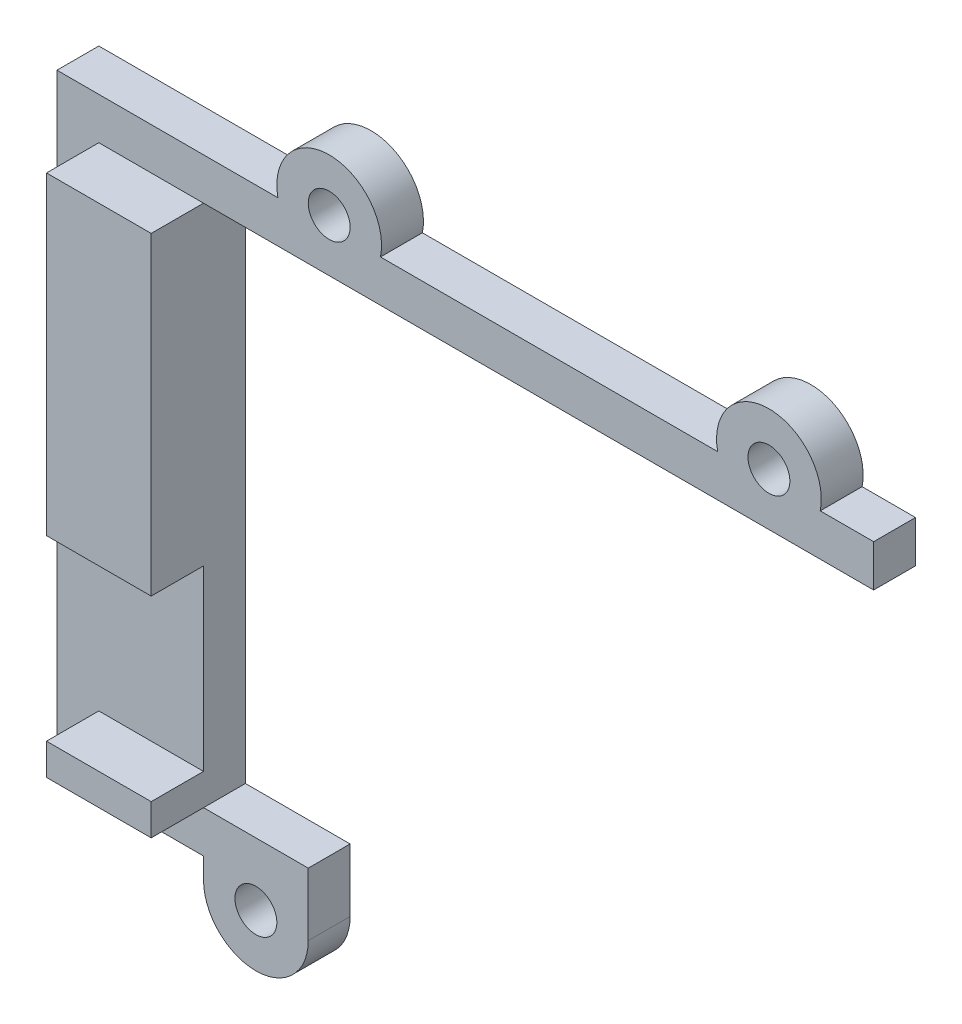
ISO-10303-21;
HEADER;
FILE_DESCRIPTION(('STEP AP214'),'2;1');
FILE_NAME('part.step','',(''),(''),'','','');
FILE_SCHEMA(('AUTOMOTIVE_DESIGN { 1 0 10303 214 1 1 1 1 }'));
ENDSEC;
DATA;
#1=APPLICATION_CONTEXT('core data for automotive mechanical design processes');
#2=APPLICATION_PROTOCOL_DEFINITION('international standard','automotive_design',2000,#1);
#3=PRODUCT_CONTEXT('',#1,'mechanical');
#4=PRODUCT('Part','Part','',(#3));
#5=PRODUCT_RELATED_PRODUCT_CATEGORY('part','',(#4));
#6=PRODUCT_DEFINITION_FORMATION('','',#4);
#7=PRODUCT_DEFINITION_CONTEXT('part definition',#1,'design');
#8=PRODUCT_DEFINITION('design','',#6,#7);
#9=PRODUCT_DEFINITION_SHAPE('','',#8);
#10=(LENGTH_UNIT() NAMED_UNIT(*) SI_UNIT(.MILLI.,.METRE.));
#11=(NAMED_UNIT(*) PLANE_ANGLE_UNIT() SI_UNIT($,.RADIAN.));
#12=(NAMED_UNIT(*) SI_UNIT($,.STERADIAN.) SOLID_ANGLE_UNIT());
#13=UNCERTAINTY_MEASURE_WITH_UNIT(LENGTH_MEASURE(1.E-05),#10,'distance_accuracy_value','');
#14=(GEOMETRIC_REPRESENTATION_CONTEXT(3) GLOBAL_UNCERTAINTY_ASSIGNED_CONTEXT((#13)) GLOBAL_UNIT_ASSIGNED_CONTEXT((#10,
#11,#12)) REPRESENTATION_CONTEXT('',''));
#15=CARTESIAN_POINT('',(0.,0.,0.));
#16=DIRECTION('',(0.,0.,1.));
#17=DIRECTION('',(1.,0.,0.));
#18=AXIS2_PLACEMENT_3D('',#15,#16,#17);
#19=CARTESIAN_POINT('',(-21.5,41.5,-4.5));
#20=DIRECTION('',(-1.,0.,0.));
#21=DIRECTION('',(0.,-1.,0.));
#22=AXIS2_PLACEMENT_3D('',#19,#20,#21);
#23=PLANE('',#22);
#24=DIRECTION('',(0.,1.,0.));
#25=VECTOR('',#24,1.);
#26=CARTESIAN_POINT('',(-21.5,41.5,-7.));
#27=LINE('',#26,#25);
#28=CARTESIAN_POINT('',(-21.5,26.5,-7.));
#29=VERTEX_POINT('',#28);
#30=CARTESIAN_POINT('',(-21.5,41.5,-7.));
#31=VERTEX_POINT('',#30);
#32=EDGE_CURVE('E338',#29,#31,#27,.T.);
#33=ORIENTED_EDGE('',*,*,#32,.F.);
#34=DIRECTION('',(0.,0.,-1.));
#35=VECTOR('',#34,1.);
#36=CARTESIAN_POINT('',(-21.5,26.5,-4.5));
#37=LINE('',#36,#35);
#38=CARTESIAN_POINT('',(-21.5,26.5,-4.5));
#39=VERTEX_POINT('',#38);
#40=EDGE_CURVE('E11',#39,#29,#37,.T.);
#41=ORIENTED_EDGE('',*,*,#40,.F.);
#42=DIRECTION('',(0.,1.,0.));
#43=VECTOR('',#42,1.);
#44=CARTESIAN_POINT('',(-21.5,41.5,-4.5));
#45=LINE('',#44,#43);
#46=CARTESIAN_POINT('',(-21.5,41.5,-4.5));
#47=VERTEX_POINT('',#46);
#48=EDGE_CURVE('E339',#39,#47,#45,.T.);
#49=ORIENTED_EDGE('',*,*,#48,.T.);
#50=DIRECTION('',(0.,0.,-1.));
#51=VECTOR('',#50,1.);
#52=CARTESIAN_POINT('',(-21.5,41.5,-4.5));
#53=LINE('',#52,#51);
#54=EDGE_CURVE('E36',#47,#31,#53,.T.);
#55=ORIENTED_EDGE('',*,*,#54,.T.);
#56=EDGE_LOOP('',(#33,#41,#49,#55));
#57=FACE_BOUND('',#56,.T.);
#58=ADVANCED_FACE('F33',(#57),#23,.T.);
#59=CARTESIAN_POINT('',(-21.5,26.5,-4.5));
#60=DIRECTION('',(0.,-1.,0.));
#61=DIRECTION('',(0.,0.,-1.));
#62=AXIS2_PLACEMENT_3D('',#59,#60,#61);
#63=PLANE('',#62);
#64=DIRECTION('',(-1.,0.,0.));
#65=VECTOR('',#64,1.);
#66=CARTESIAN_POINT('',(-21.5,26.5,-7.));
#67=LINE('',#66,#65);
#68=CARTESIAN_POINT('',(-16.5,26.5,-7.));
#69=VERTEX_POINT('',#68);
#70=EDGE_CURVE('E342',#69,#29,#67,.T.);
#71=ORIENTED_EDGE('',*,*,#70,.F.);
#72=DIRECTION('',(0.,0.,-1.));
#73=VECTOR('',#72,1.);
#74=CARTESIAN_POINT('',(-16.5,26.5,-4.5));
#75=LINE('',#74,#73);
#76=CARTESIAN_POINT('',(-16.5,26.5,-4.5));
#77=VERTEX_POINT('',#76);
#78=EDGE_CURVE('E41',#77,#69,#75,.T.);
#79=ORIENTED_EDGE('',*,*,#78,.F.);
#80=DIRECTION('',(-1.,0.,0.));
#81=VECTOR('',#80,1.);
#82=CARTESIAN_POINT('',(-21.5,26.5,-4.5));
#83=LINE('',#82,#81);
#84=EDGE_CURVE('E346',#77,#39,#83,.T.);
#85=ORIENTED_EDGE('',*,*,#84,.T.);
#86=ORIENTED_EDGE('',*,*,#40,.T.);
#87=EDGE_LOOP('',(#71,#79,#85,#86));
#88=FACE_BOUND('',#87,.T.);
#89=ADVANCED_FACE('F364',(#88),#63,.T.);
#90=CARTESIAN_POINT('',(-16.5,41.5,-4.5));
#91=DIRECTION('',(1.,0.,0.));
#92=DIRECTION('',(0.,1.,0.));
#93=AXIS2_PLACEMENT_3D('',#90,#91,#92);
#94=PLANE('',#93);
#95=ORIENTED_EDGE('',*,*,#78,.T.);
#96=DIRECTION('',(0.,-1.,0.));
#97=VECTOR('',#96,1.);
#98=CARTESIAN_POINT('',(-16.5,41.5,-7.));
#99=LINE('',#98,#97);
#100=CARTESIAN_POINT('',(-16.5,18.,-7.));
#101=VERTEX_POINT('',#100);
#102=EDGE_CURVE('E286',#69,#101,#99,.T.);
#103=ORIENTED_EDGE('',*,*,#102,.T.);
#104=DIRECTION('',(0.,0.,-1.));
#105=VECTOR('',#104,1.);
#106=CARTESIAN_POINT('',(-16.5,18.,-4.5));
#107=LINE('',#106,#105);
#108=CARTESIAN_POINT('',(-16.5,18.,-4.5));
#109=VERTEX_POINT('',#108);
#110=EDGE_CURVE('E49',#109,#101,#107,.T.);
#111=ORIENTED_EDGE('',*,*,#110,.F.);
#112=DIRECTION('',(0.,-1.,0.));
#113=VECTOR('',#112,1.);
#114=CARTESIAN_POINT('',(-16.5,16.5,-4.5));
#115=LINE('',#114,#113);
#116=CARTESIAN_POINT('',(-16.5,16.5,-4.5));
#117=VERTEX_POINT('',#116);
#118=EDGE_CURVE('E201',#109,#117,#115,.T.);
#119=ORIENTED_EDGE('',*,*,#118,.T.);
#120=DIRECTION('',(0.,0.,-1.));
#121=VECTOR('',#120,1.);
#122=CARTESIAN_POINT('',(-16.5,16.5,-4.5));
#123=LINE('',#122,#121);
#124=CARTESIAN_POINT('',(-16.5,16.5,-7.));
#125=VERTEX_POINT('',#124);
#126=EDGE_CURVE('E217',#117,#125,#123,.T.);
#127=ORIENTED_EDGE('',*,*,#126,.T.);
#128=DIRECTION('',(0.,0.,1.));
#129=VECTOR('',#128,1.);
#130=CARTESIAN_POINT('',(-16.5,16.5,-9.));
#131=LINE('',#130,#129);
#132=CARTESIAN_POINT('',(-16.5,16.5,-9.));
#133=VERTEX_POINT('',#132);
#134=EDGE_CURVE('E311',#133,#125,#131,.T.);
#135=ORIENTED_EDGE('',*,*,#134,.F.);
#136=DIRECTION('',(0.,-1.,0.));
#137=VECTOR('',#136,1.);
#138=CARTESIAN_POINT('',(-16.5,41.5,-9.));
#139=LINE('',#138,#137);
#140=CARTESIAN_POINT('',(-16.5,41.5,-9.));
#141=VERTEX_POINT('',#140);
#142=EDGE_CURVE('E256',#141,#133,#139,.T.);
#143=ORIENTED_EDGE('',*,*,#142,.F.);
#144=DIRECTION('',(0.,0.,1.));
#145=VECTOR('',#144,1.);
#146=CARTESIAN_POINT('',(-16.5,41.5,-9.));
#147=LINE('',#146,#145);
#148=CARTESIAN_POINT('',(-16.5,41.5,-7.));
#149=VERTEX_POINT('',#148);
#150=EDGE_CURVE('E314',#141,#149,#147,.T.);
#151=ORIENTED_EDGE('',*,*,#150,.T.);
#152=DIRECTION('',(0.,0.,-1.));
#153=VECTOR('',#152,1.);
#154=CARTESIAN_POINT('',(-16.5,41.5,-4.5));
#155=LINE('',#154,#153);
#156=CARTESIAN_POINT('',(-16.5,41.5,-4.5));
#157=VERTEX_POINT('',#156);
#158=EDGE_CURVE('E356',#157,#149,#155,.T.);
#159=ORIENTED_EDGE('',*,*,#158,.F.);
#160=DIRECTION('',(0.,-1.,0.));
#161=VECTOR('',#160,1.);
#162=CARTESIAN_POINT('',(-16.5,41.5,-4.5));
#163=LINE('',#162,#161);
#164=EDGE_CURVE('E344',#157,#77,#163,.T.);
#165=ORIENTED_EDGE('',*,*,#164,.T.);
#166=EDGE_LOOP('',(#95,#103,#111,#119,#127,#135,#143,#151,#159,#165));
#167=FACE_BOUND('',#166,.T.);
#168=ADVANCED_FACE('F369',(#167),#94,.T.);
#169=CARTESIAN_POINT('',(-21.5,41.5,-4.5));
#170=DIRECTION('',(0.,1.,0.));
#171=DIRECTION('',(0.,0.,1.));
#172=AXIS2_PLACEMENT_3D('',#169,#170,#171);
#173=PLANE('',#172);
#174=DIRECTION('',(1.,0.,0.));
#175=VECTOR('',#174,1.);
#176=CARTESIAN_POINT('',(-21.5,41.5,-7.));
#177=LINE('',#176,#175);
#178=EDGE_CURVE('E351',#31,#149,#177,.T.);
#179=ORIENTED_EDGE('',*,*,#178,.F.);
#180=ORIENTED_EDGE('',*,*,#54,.F.);
#181=DIRECTION('',(1.,0.,0.));
#182=VECTOR('',#181,1.);
#183=CARTESIAN_POINT('',(-21.5,41.5,-4.5));
#184=LINE('',#183,#182);
#185=EDGE_CURVE('E341',#47,#157,#184,.T.);
#186=ORIENTED_EDGE('',*,*,#185,.T.);
#187=ORIENTED_EDGE('',*,*,#158,.T.);
#188=EDGE_LOOP('',(#179,#180,#186,#187));
#189=FACE_BOUND('',#188,.T.);
#190=ADVANCED_FACE('F357',(#189),#173,.T.);
#191=CARTESIAN_POINT('',(0.,0.,-4.5));
#192=DIRECTION('',(0.,0.,1.));
#193=DIRECTION('',(1.,0.,0.));
#194=AXIS2_PLACEMENT_3D('',#191,#192,#193);
#195=PLANE('',#194);
#196=ORIENTED_EDGE('',*,*,#48,.F.);
#197=ORIENTED_EDGE('',*,*,#84,.F.);
#198=ORIENTED_EDGE('',*,*,#164,.F.);
#199=ORIENTED_EDGE('',*,*,#185,.F.);
#200=EDGE_LOOP('',(#196,#197,#198,#199));
#201=FACE_BOUND('',#200,.T.);
#202=ADVANCED_FACE('F368',(#201),#195,.T.);
#203=CARTESIAN_POINT('',(-14.,13.5,-7.));
#204=DIRECTION('',(0.,0.,-1.));
#205=DIRECTION('',(-1.,0.,0.));
#206=AXIS2_PLACEMENT_3D('',#203,#204,#205);
#207=PLANE('',#206);
#208=CARTESIAN_POINT('',(10.5,44.,-7.));
#209=DIRECTION('',(0.,0.,-1.));
#210=DIRECTION('',(-1.,0.,0.));
#211=AXIS2_PLACEMENT_3D('',#208,#209,#210);
#212=CIRCLE('',#211,1.);
#213=CARTESIAN_POINT('',(9.49999999999999,44.,-7.));
#214=VERTEX_POINT('',#213);
#215=EDGE_CURVE('E229',#214,#214,#212,.T.);
#216=ORIENTED_EDGE('',*,*,#215,.T.);
#217=EDGE_LOOP('',(#216));
#218=FACE_BOUND('',#217,.T.);
#219=CARTESIAN_POINT('',(-10.5,44.,-7.));
#220=DIRECTION('',(0.,0.,-1.));
#221=DIRECTION('',(-1.,0.,0.));
#222=AXIS2_PLACEMENT_3D('',#219,#220,#221);
#223=CIRCLE('',#222,1.);
#224=CARTESIAN_POINT('',(-11.5,44.,-7.));
#225=VERTEX_POINT('',#224);
#226=EDGE_CURVE('E223',#225,#225,#223,.T.);
#227=ORIENTED_EDGE('',*,*,#226,.T.);
#228=EDGE_LOOP('',(#227));
#229=FACE_BOUND('',#228,.T.);
#230=CARTESIAN_POINT('',(-14.,13.5,-7.));
#231=DIRECTION('',(0.,0.,-1.));
#232=DIRECTION('',(-1.,0.,0.));
#233=AXIS2_PLACEMENT_3D('',#230,#231,#232);
#234=CIRCLE('',#233,1.);
#235=CARTESIAN_POINT('',(-15.,13.5,-7.));
#236=VERTEX_POINT('',#235);
#237=EDGE_CURVE('E216',#236,#236,#234,.T.);
#238=ORIENTED_EDGE('',*,*,#237,.T.);
#239=EDGE_LOOP('',(#238));
#240=FACE_BOUND('',#239,.T.);
#241=DIRECTION('',(1.,0.,0.));
#242=VECTOR('',#241,1.);
#243=CARTESIAN_POINT('',(-11.5,16.5,-7.));
#244=LINE('',#243,#242);
#245=CARTESIAN_POINT('',(-11.5,16.5,-7.));
#246=VERTEX_POINT('',#245);
#247=EDGE_CURVE('E288',#125,#246,#244,.T.);
#248=ORIENTED_EDGE('',*,*,#247,.F.);
#249=DIRECTION('',(-1.,0.,0.));
#250=VECTOR('',#249,1.);
#251=CARTESIAN_POINT('',(-21.5,16.5,-7.));
#252=LINE('',#251,#250);
#253=CARTESIAN_POINT('',(-21.5,16.5,-7.));
#254=VERTEX_POINT('',#253);
#255=EDGE_CURVE('E205',#125,#254,#252,.T.);
#256=ORIENTED_EDGE('',*,*,#255,.T.);
#257=DIRECTION('',(0.,1.,0.));
#258=VECTOR('',#257,1.);
#259=CARTESIAN_POINT('',(-21.5,16.5,-7.));
#260=LINE('',#259,#258);
#261=CARTESIAN_POINT('',(-21.5,18.,-7.));
#262=VERTEX_POINT('',#261);
#263=EDGE_CURVE('E212',#254,#262,#260,.T.);
#264=ORIENTED_EDGE('',*,*,#263,.T.);
#265=DIRECTION('',(1.,0.,0.));
#266=VECTOR('',#265,1.);
#267=CARTESIAN_POINT('',(-21.5,18.,-7.));
#268=LINE('',#267,#266);
#269=EDGE_CURVE('E186',#262,#101,#268,.T.);
#270=ORIENTED_EDGE('',*,*,#269,.T.);
#271=ORIENTED_EDGE('',*,*,#102,.F.);
#272=ORIENTED_EDGE('',*,*,#70,.T.);
#273=ORIENTED_EDGE('',*,*,#32,.T.);
#274=ORIENTED_EDGE('',*,*,#178,.T.);
#275=DIRECTION('',(-1.,0.,0.));
#276=VECTOR('',#275,1.);
#277=CARTESIAN_POINT('',(15.5,41.5,-7.));
#278=LINE('',#277,#276);
#279=CARTESIAN_POINT('',(15.5,41.5,-7.));
#280=VERTEX_POINT('',#279);
#281=EDGE_CURVE('E283',#280,#149,#278,.T.);
#282=ORIENTED_EDGE('',*,*,#281,.F.);
#283=DIRECTION('',(0.,-1.,0.));
#284=VECTOR('',#283,1.);
#285=CARTESIAN_POINT('',(15.5,43.5,-7.));
#286=LINE('',#285,#284);
#287=CARTESIAN_POINT('',(15.5,43.5,-7.));
#288=VERTEX_POINT('',#287);
#289=EDGE_CURVE('E281',#288,#280,#286,.T.);
#290=ORIENTED_EDGE('',*,*,#289,.F.);
#291=DIRECTION('',(1.,0.,0.));
#292=VECTOR('',#291,1.);
#293=CARTESIAN_POINT('',(12.9494897427832,43.5,-7.));
#294=LINE('',#293,#292);
#295=CARTESIAN_POINT('',(12.9494897427832,43.5,-7.));
#296=VERTEX_POINT('',#295);
#297=EDGE_CURVE('E279',#296,#288,#294,.T.);
#298=ORIENTED_EDGE('',*,*,#297,.F.);
#299=CARTESIAN_POINT('',(10.5,44.,-7.));
#300=DIRECTION('',(0.,0.,-1.));
#301=DIRECTION('',(-1.,0.,0.));
#302=AXIS2_PLACEMENT_3D('',#299,#300,#301);
#303=CIRCLE('',#302,2.5);
#304=CARTESIAN_POINT('',(8.05051025721681,43.5,-7.));
#305=VERTEX_POINT('',#304);
#306=EDGE_CURVE('E277',#305,#296,#303,.T.);
#307=ORIENTED_EDGE('',*,*,#306,.F.);
#308=DIRECTION('',(1.,0.,0.));
#309=VECTOR('',#308,1.);
#310=CARTESIAN_POINT('',(-8.05051025721683,43.5,-7.));
#311=LINE('',#310,#309);
#312=CARTESIAN_POINT('',(-8.05051025721683,43.5,-7.));
#313=VERTEX_POINT('',#312);
#314=EDGE_CURVE('E275',#313,#305,#311,.T.);
#315=ORIENTED_EDGE('',*,*,#314,.F.);
#316=CARTESIAN_POINT('',(-10.5,44.,-7.));
#317=DIRECTION('',(0.,0.,-1.));
#318=DIRECTION('',(-1.,0.,0.));
#319=AXIS2_PLACEMENT_3D('',#316,#317,#318);
#320=CIRCLE('',#319,2.5);
#321=CARTESIAN_POINT('',(-12.9494897427832,43.5,-7.));
#322=VERTEX_POINT('',#321);
#323=EDGE_CURVE('E273',#322,#313,#320,.T.);
#324=ORIENTED_EDGE('',*,*,#323,.F.);
#325=DIRECTION('',(1.,0.,0.));
#326=VECTOR('',#325,1.);
#327=CARTESIAN_POINT('',(-16.5,43.5,-7.));
#328=LINE('',#327,#326);
#329=CARTESIAN_POINT('',(-23.5,43.5,-7.));
#330=VERTEX_POINT('',#329);
#331=EDGE_CURVE('E271',#330,#322,#328,.T.);
#332=ORIENTED_EDGE('',*,*,#331,.F.);
#333=DIRECTION('',(0.,1.,0.));
#334=VECTOR('',#333,1.);
#335=CARTESIAN_POINT('',(-23.5,43.5,-7.));
#336=LINE('',#335,#334);
#337=CARTESIAN_POINT('',(-23.5,14.5,-7.));
#338=VERTEX_POINT('',#337);
#339=EDGE_CURVE('E235',#338,#330,#336,.T.);
#340=ORIENTED_EDGE('',*,*,#339,.F.);
#341=DIRECTION('',(-1.,0.,0.));
#342=VECTOR('',#341,1.);
#343=CARTESIAN_POINT('',(-23.5,14.5,-7.));
#344=LINE('',#343,#342);
#345=CARTESIAN_POINT('',(-16.5,14.5,-7.));
#346=VERTEX_POINT('',#345);
#347=EDGE_CURVE('E242',#346,#338,#344,.T.);
#348=ORIENTED_EDGE('',*,*,#347,.F.);
#349=DIRECTION('',(0.,1.,0.));
#350=VECTOR('',#349,1.);
#351=CARTESIAN_POINT('',(-16.5,14.5,-7.));
#352=LINE('',#351,#350);
#353=CARTESIAN_POINT('',(-16.5,13.5,-7.));
#354=VERTEX_POINT('',#353);
#355=EDGE_CURVE('E294',#354,#346,#352,.T.);
#356=ORIENTED_EDGE('',*,*,#355,.F.);
#357=CARTESIAN_POINT('',(-14.,13.5,-7.));
#358=DIRECTION('',(0.,0.,-1.));
#359=DIRECTION('',(-1.,0.,0.));
#360=AXIS2_PLACEMENT_3D('',#357,#358,#359);
#361=CIRCLE('',#360,2.5);
#362=CARTESIAN_POINT('',(-11.5,13.5,-7.));
#363=VERTEX_POINT('',#362);
#364=EDGE_CURVE('E292',#363,#354,#361,.T.);
#365=ORIENTED_EDGE('',*,*,#364,.F.);
#366=DIRECTION('',(0.,-1.,0.));
#367=VECTOR('',#366,1.);
#368=CARTESIAN_POINT('',(-11.5,13.5,-7.));
#369=LINE('',#368,#367);
#370=EDGE_CURVE('E290',#246,#363,#369,.T.);
#371=ORIENTED_EDGE('',*,*,#370,.F.);
#372=EDGE_LOOP('',(#248,#256,#264,#270,#271,#272,#273,#274,#282,#290,#298,#307,#315,#324,#332,
#340,#348,#356,#365,#371));
#373=FACE_BOUND('',#372,.T.);
#374=ADVANCED_FACE('F361',(#218,#229,#240,#373),#207,.F.);
#375=CARTESIAN_POINT('',(-14.,13.5,-9.));
#376=DIRECTION('',(0.,0.,-1.));
#377=DIRECTION('',(-1.,0.,0.));
#378=AXIS2_PLACEMENT_3D('',#375,#376,#377);
#379=PLANE('',#378);
#380=CARTESIAN_POINT('',(-10.5,44.,-9.));
#381=DIRECTION('',(0.,0.,-1.));
#382=DIRECTION('',(-1.,0.,0.));
#383=AXIS2_PLACEMENT_3D('',#380,#381,#382);
#384=CIRCLE('',#383,1.);
#385=CARTESIAN_POINT('',(-11.5,44.,-9.));
#386=VERTEX_POINT('',#385);
#387=EDGE_CURVE('E226',#386,#386,#384,.T.);
#388=ORIENTED_EDGE('',*,*,#387,.F.);
#389=EDGE_LOOP('',(#388));
#390=FACE_BOUND('',#389,.T.);
#391=DIRECTION('',(0.,1.,0.));
#392=VECTOR('',#391,1.);
#393=CARTESIAN_POINT('',(-23.5,43.5,-9.));
#394=LINE('',#393,#392);
#395=CARTESIAN_POINT('',(-23.5,14.5,-9.));
#396=VERTEX_POINT('',#395);
#397=CARTESIAN_POINT('',(-23.5,43.5,-9.));
#398=VERTEX_POINT('',#397);
#399=EDGE_CURVE('E238',#396,#398,#394,.T.);
#400=ORIENTED_EDGE('',*,*,#399,.T.);
#401=DIRECTION('',(1.,0.,0.));
#402=VECTOR('',#401,1.);
#403=CARTESIAN_POINT('',(-23.5,43.5,-9.));
#404=LINE('',#403,#402);
#405=CARTESIAN_POINT('',(-12.9494897427832,43.5,-9.));
#406=VERTEX_POINT('',#405);
#407=EDGE_CURVE('E241',#398,#406,#404,.T.);
#408=ORIENTED_EDGE('',*,*,#407,.T.);
#409=CARTESIAN_POINT('',(-10.5,44.,-9.));
#410=DIRECTION('',(0.,0.,-1.));
#411=DIRECTION('',(-1.,0.,0.));
#412=AXIS2_PLACEMENT_3D('',#409,#410,#411);
#413=CIRCLE('',#412,2.5);
#414=CARTESIAN_POINT('',(-8.05051025721683,43.5,-9.));
#415=VERTEX_POINT('',#414);
#416=EDGE_CURVE('E244',#406,#415,#413,.T.);
#417=ORIENTED_EDGE('',*,*,#416,.T.);
#418=DIRECTION('',(1.,0.,0.));
#419=VECTOR('',#418,1.);
#420=CARTESIAN_POINT('',(-8.05051025721683,43.5,-9.));
#421=LINE('',#420,#419);
#422=CARTESIAN_POINT('',(8.05051025721681,43.5,-9.));
#423=VERTEX_POINT('',#422);
#424=EDGE_CURVE('E246',#415,#423,#421,.T.);
#425=ORIENTED_EDGE('',*,*,#424,.T.);
#426=CARTESIAN_POINT('',(10.5,44.,-9.));
#427=DIRECTION('',(0.,0.,-1.));
#428=DIRECTION('',(-1.,0.,0.));
#429=AXIS2_PLACEMENT_3D('',#426,#427,#428);
#430=CIRCLE('',#429,2.5);
#431=CARTESIAN_POINT('',(12.9494897427832,43.5,-9.));
#432=VERTEX_POINT('',#431);
#433=EDGE_CURVE('E248',#423,#432,#430,.T.);
#434=ORIENTED_EDGE('',*,*,#433,.T.);
#435=DIRECTION('',(1.,0.,0.));
#436=VECTOR('',#435,1.);
#437=CARTESIAN_POINT('',(12.9494897427832,43.5,-9.));
#438=LINE('',#437,#436);
#439=CARTESIAN_POINT('',(15.5,43.5,-9.));
#440=VERTEX_POINT('',#439);
#441=EDGE_CURVE('E250',#432,#440,#438,.T.);
#442=ORIENTED_EDGE('',*,*,#441,.T.);
#443=DIRECTION('',(0.,-1.,0.));
#444=VECTOR('',#443,1.);
#445=CARTESIAN_POINT('',(15.5,43.5,-9.));
#446=LINE('',#445,#444);
#447=CARTESIAN_POINT('',(15.5,41.5,-9.));
#448=VERTEX_POINT('',#447);
#449=EDGE_CURVE('E252',#440,#448,#446,.T.);
#450=ORIENTED_EDGE('',*,*,#449,.T.);
#451=DIRECTION('',(-1.,0.,0.));
#452=VECTOR('',#451,1.);
#453=CARTESIAN_POINT('',(15.5,41.5,-9.));
#454=LINE('',#453,#452);
#455=EDGE_CURVE('E254',#448,#141,#454,.T.);
#456=ORIENTED_EDGE('',*,*,#455,.T.);
#457=ORIENTED_EDGE('',*,*,#142,.T.);
#458=DIRECTION('',(1.,0.,0.));
#459=VECTOR('',#458,1.);
#460=CARTESIAN_POINT('',(-11.5,16.5,-9.));
#461=LINE('',#460,#459);
#462=CARTESIAN_POINT('',(-11.5,16.5,-9.));
#463=VERTEX_POINT('',#462);
#464=EDGE_CURVE('E258',#133,#463,#461,.T.);
#465=ORIENTED_EDGE('',*,*,#464,.T.);
#466=DIRECTION('',(0.,-1.,0.));
#467=VECTOR('',#466,1.);
#468=CARTESIAN_POINT('',(-11.5,13.5,-9.));
#469=LINE('',#468,#467);
#470=CARTESIAN_POINT('',(-11.5,13.5,-9.));
#471=VERTEX_POINT('',#470);
#472=EDGE_CURVE('E260',#463,#471,#469,.T.);
#473=ORIENTED_EDGE('',*,*,#472,.T.);
#474=CARTESIAN_POINT('',(-14.,13.5,-9.));
#475=DIRECTION('',(0.,0.,-1.));
#476=DIRECTION('',(-1.,0.,0.));
#477=AXIS2_PLACEMENT_3D('',#474,#475,#476);
#478=CIRCLE('',#477,2.5);
#479=CARTESIAN_POINT('',(-16.5,13.5,-9.));
#480=VERTEX_POINT('',#479);
#481=EDGE_CURVE('E262',#471,#480,#478,.T.);
#482=ORIENTED_EDGE('',*,*,#481,.T.);
#483=DIRECTION('',(0.,1.,0.));
#484=VECTOR('',#483,1.);
#485=CARTESIAN_POINT('',(-16.5,14.5,-9.));
#486=LINE('',#485,#484);
#487=CARTESIAN_POINT('',(-16.5,14.5,-9.));
#488=VERTEX_POINT('',#487);
#489=EDGE_CURVE('E264',#480,#488,#486,.T.);
#490=ORIENTED_EDGE('',*,*,#489,.T.);
#491=DIRECTION('',(-1.,0.,0.));
#492=VECTOR('',#491,1.);
#493=CARTESIAN_POINT('',(-23.5,14.5,-9.));
#494=LINE('',#493,#492);
#495=EDGE_CURVE('E266',#488,#396,#494,.T.);
#496=ORIENTED_EDGE('',*,*,#495,.T.);
#497=EDGE_LOOP('',(#400,#408,#417,#425,#434,#442,#450,#456,#457,#465,#473,#482,#490,#496));
#498=FACE_BOUND('',#497,.T.);
#499=CARTESIAN_POINT('',(10.5,44.,-9.));
#500=DIRECTION('',(0.,0.,-1.));
#501=DIRECTION('',(-1.,0.,0.));
#502=AXIS2_PLACEMENT_3D('',#499,#500,#501);
#503=CIRCLE('',#502,1.);
#504=CARTESIAN_POINT('',(9.49999999999999,44.,-9.));
#505=VERTEX_POINT('',#504);
#506=EDGE_CURVE('E232',#505,#505,#503,.T.);
#507=ORIENTED_EDGE('',*,*,#506,.F.);
#508=EDGE_LOOP('',(#507));
#509=FACE_BOUND('',#508,.T.);
#510=CARTESIAN_POINT('',(-14.,13.5,-9.));
#511=DIRECTION('',(0.,0.,-1.));
#512=DIRECTION('',(-1.,0.,0.));
#513=AXIS2_PLACEMENT_3D('',#510,#511,#512);
#514=CIRCLE('',#513,1.);
#515=CARTESIAN_POINT('',(-15.,13.5,-9.));
#516=VERTEX_POINT('',#515);
#517=EDGE_CURVE('E220',#516,#516,#514,.T.);
#518=ORIENTED_EDGE('',*,*,#517,.F.);
#519=EDGE_LOOP('',(#518));
#520=FACE_BOUND('',#519,.T.);
#521=ADVANCED_FACE('F464',(#390,#498,#509,#520),#379,.T.);
#522=CARTESIAN_POINT('',(-23.5,43.5,-9.));
#523=DIRECTION('',(1.,0.,0.));
#524=DIRECTION('',(0.,0.,-1.));
#525=AXIS2_PLACEMENT_3D('',#522,#523,#524);
#526=PLANE('',#525);
#527=ORIENTED_EDGE('',*,*,#339,.T.);
#528=DIRECTION('',(0.,0.,1.));
#529=VECTOR('',#528,1.);
#530=CARTESIAN_POINT('',(-23.5,43.5,-9.));
#531=LINE('',#530,#529);
#532=EDGE_CURVE('E335',#398,#330,#531,.T.);
#533=ORIENTED_EDGE('',*,*,#532,.F.);
#534=ORIENTED_EDGE('',*,*,#399,.F.);
#535=DIRECTION('',(0.,0.,1.));
#536=VECTOR('',#535,1.);
#537=CARTESIAN_POINT('',(-23.5,14.5,-9.));
#538=LINE('',#537,#536);
#539=EDGE_CURVE('E268',#396,#338,#538,.T.);
#540=ORIENTED_EDGE('',*,*,#539,.T.);
#541=EDGE_LOOP('',(#527,#533,#534,#540));
#542=FACE_BOUND('',#541,.T.);
#543=ADVANCED_FACE('F409',(#542),#526,.F.);
#544=CARTESIAN_POINT('',(-16.5,43.5,-9.));
#545=DIRECTION('',(0.,-1.,0.));
#546=DIRECTION('',(0.,0.,-1.));
#547=AXIS2_PLACEMENT_3D('',#544,#545,#546);
#548=PLANE('',#547);
#549=ORIENTED_EDGE('',*,*,#331,.T.);
#550=DIRECTION('',(0.,0.,1.));
#551=VECTOR('',#550,1.);
#552=CARTESIAN_POINT('',(-12.9494897427832,43.5,-9.));
#553=LINE('',#552,#551);
#554=EDGE_CURVE('E332',#406,#322,#553,.T.);
#555=ORIENTED_EDGE('',*,*,#554,.F.);
#556=ORIENTED_EDGE('',*,*,#407,.F.);
#557=ORIENTED_EDGE('',*,*,#532,.T.);
#558=EDGE_LOOP('',(#549,#555,#556,#557));
#559=FACE_BOUND('',#558,.T.);
#560=ADVANCED_FACE('F403',(#559),#548,.F.);
#561=CARTESIAN_POINT('',(-10.5,44.,-9.));
#562=DIRECTION('',(0.,0.,1.));
#563=DIRECTION('',(1.,0.,0.));
#564=AXIS2_PLACEMENT_3D('',#561,#562,#563);
#565=CYLINDRICAL_SURFACE('',#564,2.5);
#566=ORIENTED_EDGE('',*,*,#323,.T.);
#567=DIRECTION('',(0.,0.,1.));
#568=VECTOR('',#567,1.);
#569=CARTESIAN_POINT('',(-8.05051025721683,43.5,-9.));
#570=LINE('',#569,#568);
#571=EDGE_CURVE('E329',#415,#313,#570,.T.);
#572=ORIENTED_EDGE('',*,*,#571,.F.);
#573=ORIENTED_EDGE('',*,*,#416,.F.);
#574=ORIENTED_EDGE('',*,*,#554,.T.);
#575=EDGE_LOOP('',(#566,#572,#573,#574));
#576=FACE_BOUND('',#575,.T.);
#577=ADVANCED_FACE('F400',(#576),#565,.T.);
#578=CARTESIAN_POINT('',(-8.05051025721683,43.5,-9.));
#579=DIRECTION('',(0.,-1.,0.));
#580=DIRECTION('',(0.,0.,-1.));
#581=AXIS2_PLACEMENT_3D('',#578,#579,#580);
#582=PLANE('',#581);
#583=ORIENTED_EDGE('',*,*,#314,.T.);
#584=DIRECTION('',(0.,0.,1.));
#585=VECTOR('',#584,1.);
#586=CARTESIAN_POINT('',(8.05051025721681,43.5,-9.));
#587=LINE('',#586,#585);
#588=EDGE_CURVE('E326',#423,#305,#587,.T.);
#589=ORIENTED_EDGE('',*,*,#588,.F.);
#590=ORIENTED_EDGE('',*,*,#424,.F.);
#591=ORIENTED_EDGE('',*,*,#571,.T.);
#592=EDGE_LOOP('',(#583,#589,#590,#591));
#593=FACE_BOUND('',#592,.T.);
#594=ADVANCED_FACE('F395',(#593),#582,.F.);
#595=CARTESIAN_POINT('',(10.5,44.,-9.));
#596=DIRECTION('',(0.,0.,1.));
#597=DIRECTION('',(1.,0.,0.));
#598=AXIS2_PLACEMENT_3D('',#595,#596,#597);
#599=CYLINDRICAL_SURFACE('',#598,2.5);
#600=ORIENTED_EDGE('',*,*,#306,.T.);
#601=DIRECTION('',(0.,0.,1.));
#602=VECTOR('',#601,1.);
#603=CARTESIAN_POINT('',(12.9494897427832,43.5,-9.));
#604=LINE('',#603,#602);
#605=EDGE_CURVE('E323',#432,#296,#604,.T.);
#606=ORIENTED_EDGE('',*,*,#605,.F.);
#607=ORIENTED_EDGE('',*,*,#433,.F.);
#608=ORIENTED_EDGE('',*,*,#588,.T.);
#609=EDGE_LOOP('',(#600,#606,#607,#608));
#610=FACE_BOUND('',#609,.T.);
#611=ADVANCED_FACE('F390',(#610),#599,.T.);
#612=CARTESIAN_POINT('',(12.9494897427832,43.5,-9.));
#613=DIRECTION('',(0.,-1.,0.));
#614=DIRECTION('',(0.,0.,-1.));
#615=AXIS2_PLACEMENT_3D('',#612,#613,#614);
#616=PLANE('',#615);
#617=ORIENTED_EDGE('',*,*,#297,.T.);
#618=DIRECTION('',(0.,0.,1.));
#619=VECTOR('',#618,1.);
#620=CARTESIAN_POINT('',(15.5,43.5,-9.));
#621=LINE('',#620,#619);
#622=EDGE_CURVE('E320',#440,#288,#621,.T.);
#623=ORIENTED_EDGE('',*,*,#622,.F.);
#624=ORIENTED_EDGE('',*,*,#441,.F.);
#625=ORIENTED_EDGE('',*,*,#605,.T.);
#626=EDGE_LOOP('',(#617,#623,#624,#625));
#627=FACE_BOUND('',#626,.T.);
#628=ADVANCED_FACE('F386',(#627),#616,.F.);
#629=CARTESIAN_POINT('',(15.5,43.5,-9.));
#630=DIRECTION('',(-1.,0.,0.));
#631=DIRECTION('',(0.,0.,1.));
#632=AXIS2_PLACEMENT_3D('',#629,#630,#631);
#633=PLANE('',#632);
#634=ORIENTED_EDGE('',*,*,#289,.T.);
#635=DIRECTION('',(0.,0.,1.));
#636=VECTOR('',#635,1.);
#637=CARTESIAN_POINT('',(15.5,41.5,-9.));
#638=LINE('',#637,#636);
#639=EDGE_CURVE('E317',#448,#280,#638,.T.);
#640=ORIENTED_EDGE('',*,*,#639,.F.);
#641=ORIENTED_EDGE('',*,*,#449,.F.);
#642=ORIENTED_EDGE('',*,*,#622,.T.);
#643=EDGE_LOOP('',(#634,#640,#641,#642));
#644=FACE_BOUND('',#643,.T.);
#645=ADVANCED_FACE('F381',(#644),#633,.F.);
#646=CARTESIAN_POINT('',(15.5,41.5,-9.));
#647=DIRECTION('',(0.,1.,0.));
#648=DIRECTION('',(0.,0.,1.));
#649=AXIS2_PLACEMENT_3D('',#646,#647,#648);
#650=PLANE('',#649);
#651=ORIENTED_EDGE('',*,*,#281,.T.);
#652=ORIENTED_EDGE('',*,*,#150,.F.);
#653=ORIENTED_EDGE('',*,*,#455,.F.);
#654=ORIENTED_EDGE('',*,*,#639,.T.);
#655=EDGE_LOOP('',(#651,#652,#653,#654));
#656=FACE_BOUND('',#655,.T.);
#657=ADVANCED_FACE('F375',(#656),#650,.F.);
#658=CARTESIAN_POINT('',(-11.5,16.5,-9.));
#659=DIRECTION('',(0.,-1.,0.));
#660=DIRECTION('',(0.,0.,-1.));
#661=AXIS2_PLACEMENT_3D('',#658,#659,#660);
#662=PLANE('',#661);
#663=ORIENTED_EDGE('',*,*,#247,.T.);
#664=DIRECTION('',(0.,0.,1.));
#665=VECTOR('',#664,1.);
#666=CARTESIAN_POINT('',(-11.5,16.5,-9.));
#667=LINE('',#666,#665);
#668=EDGE_CURVE('E308',#463,#246,#667,.T.);
#669=ORIENTED_EDGE('',*,*,#668,.F.);
#670=ORIENTED_EDGE('',*,*,#464,.F.);
#671=ORIENTED_EDGE('',*,*,#134,.T.);
#672=EDGE_LOOP('',(#663,#669,#670,#671));
#673=FACE_BOUND('',#672,.T.);
#674=ADVANCED_FACE('F432',(#673),#662,.F.);
#675=CARTESIAN_POINT('',(-11.5,13.5,-9.));
#676=DIRECTION('',(-1.,0.,0.));
#677=DIRECTION('',(0.,0.,1.));
#678=AXIS2_PLACEMENT_3D('',#675,#676,#677);
#679=PLANE('',#678);
#680=ORIENTED_EDGE('',*,*,#370,.T.);
#681=DIRECTION('',(0.,0.,1.));
#682=VECTOR('',#681,1.);
#683=CARTESIAN_POINT('',(-11.5,13.5,-9.));
#684=LINE('',#683,#682);
#685=EDGE_CURVE('E305',#471,#363,#684,.T.);
#686=ORIENTED_EDGE('',*,*,#685,.F.);
#687=ORIENTED_EDGE('',*,*,#472,.F.);
#688=ORIENTED_EDGE('',*,*,#668,.T.);
#689=EDGE_LOOP('',(#680,#686,#687,#688));
#690=FACE_BOUND('',#689,.T.);
#691=ADVANCED_FACE('F428',(#690),#679,.F.);
#692=CARTESIAN_POINT('',(-14.,13.5,-9.));
#693=DIRECTION('',(0.,0.,1.));
#694=DIRECTION('',(1.,0.,0.));
#695=AXIS2_PLACEMENT_3D('',#692,#693,#694);
#696=CYLINDRICAL_SURFACE('',#695,2.5);
#697=ORIENTED_EDGE('',*,*,#364,.T.);
#698=DIRECTION('',(0.,0.,1.));
#699=VECTOR('',#698,1.);
#700=CARTESIAN_POINT('',(-16.5,13.5,-9.));
#701=LINE('',#700,#699);
#702=EDGE_CURVE('E302',#480,#354,#701,.T.);
#703=ORIENTED_EDGE('',*,*,#702,.F.);
#704=ORIENTED_EDGE('',*,*,#481,.F.);
#705=ORIENTED_EDGE('',*,*,#685,.T.);
#706=EDGE_LOOP('',(#697,#703,#704,#705));
#707=FACE_BOUND('',#706,.T.);
#708=ADVANCED_FACE('F423',(#707),#696,.T.);
#709=CARTESIAN_POINT('',(-16.5,14.5,-9.));
#710=DIRECTION('',(1.,0.,0.));
#711=DIRECTION('',(0.,1.,0.));
#712=AXIS2_PLACEMENT_3D('',#709,#710,#711);
#713=PLANE('',#712);
#714=ORIENTED_EDGE('',*,*,#355,.T.);
#715=DIRECTION('',(0.,0.,1.));
#716=VECTOR('',#715,1.);
#717=CARTESIAN_POINT('',(-16.5,14.5,-9.));
#718=LINE('',#717,#716);
#719=EDGE_CURVE('E299',#488,#346,#718,.T.);
#720=ORIENTED_EDGE('',*,*,#719,.F.);
#721=ORIENTED_EDGE('',*,*,#489,.F.);
#722=ORIENTED_EDGE('',*,*,#702,.T.);
#723=EDGE_LOOP('',(#714,#720,#721,#722));
#724=FACE_BOUND('',#723,.T.);
#725=ADVANCED_FACE('F418',(#724),#713,.F.);
#726=CARTESIAN_POINT('',(-23.5,14.5,-9.));
#727=DIRECTION('',(0.,1.,0.));
#728=DIRECTION('',(0.,0.,1.));
#729=AXIS2_PLACEMENT_3D('',#726,#727,#728);
#730=PLANE('',#729);
#731=ORIENTED_EDGE('',*,*,#347,.T.);
#732=ORIENTED_EDGE('',*,*,#539,.F.);
#733=ORIENTED_EDGE('',*,*,#495,.F.);
#734=ORIENTED_EDGE('',*,*,#719,.T.);
#735=EDGE_LOOP('',(#731,#732,#733,#734));
#736=FACE_BOUND('',#735,.T.);
#737=ADVANCED_FACE('F414',(#736),#730,.F.);
#738=CARTESIAN_POINT('',(10.5,44.,-9.));
#739=DIRECTION('',(0.,0.,1.));
#740=DIRECTION('',(1.,0.,0.));
#741=AXIS2_PLACEMENT_3D('',#738,#739,#740);
#742=CYLINDRICAL_SURFACE('',#741,1.);
#743=ORIENTED_EDGE('',*,*,#506,.T.);
#744=EDGE_LOOP('',(#743));
#745=FACE_BOUND('',#744,.T.);
#746=ORIENTED_EDGE('',*,*,#215,.F.);
#747=EDGE_LOOP('',(#746));
#748=FACE_BOUND('',#747,.T.);
#749=ADVANCED_FACE('F477',(#745,#748),#742,.F.);
#750=CARTESIAN_POINT('',(-10.5,44.,-9.));
#751=DIRECTION('',(0.,0.,1.));
#752=DIRECTION('',(1.,0.,0.));
#753=AXIS2_PLACEMENT_3D('',#750,#751,#752);
#754=CYLINDRICAL_SURFACE('',#753,1.);
#755=ORIENTED_EDGE('',*,*,#387,.T.);
#756=EDGE_LOOP('',(#755));
#757=FACE_BOUND('',#756,.T.);
#758=ORIENTED_EDGE('',*,*,#226,.F.);
#759=EDGE_LOOP('',(#758));
#760=FACE_BOUND('',#759,.T.);
#761=ADVANCED_FACE('F558',(#757,#760),#754,.F.);
#762=CARTESIAN_POINT('',(-14.,13.5,-9.));
#763=DIRECTION('',(0.,0.,1.));
#764=DIRECTION('',(1.,0.,0.));
#765=AXIS2_PLACEMENT_3D('',#762,#763,#764);
#766=CYLINDRICAL_SURFACE('',#765,1.);
#767=ORIENTED_EDGE('',*,*,#517,.T.);
#768=EDGE_LOOP('',(#767));
#769=FACE_BOUND('',#768,.T.);
#770=ORIENTED_EDGE('',*,*,#237,.F.);
#771=EDGE_LOOP('',(#770));
#772=FACE_BOUND('',#771,.T.);
#773=ADVANCED_FACE('F443',(#769,#772),#766,.F.);
#774=CARTESIAN_POINT('',(-21.5,16.5,-4.5));
#775=DIRECTION('',(-1.,0.,0.));
#776=DIRECTION('',(0.,0.,1.));
#777=AXIS2_PLACEMENT_3D('',#774,#775,#776);
#778=PLANE('',#777);
#779=ORIENTED_EDGE('',*,*,#263,.F.);
#780=DIRECTION('',(0.,0.,-1.));
#781=VECTOR('',#780,1.);
#782=CARTESIAN_POINT('',(-21.5,16.5,-4.5));
#783=LINE('',#782,#781);
#784=CARTESIAN_POINT('',(-21.5,16.5,-4.5));
#785=VERTEX_POINT('',#784);
#786=EDGE_CURVE('E204',#785,#254,#783,.T.);
#787=ORIENTED_EDGE('',*,*,#786,.F.);
#788=DIRECTION('',(0.,1.,0.));
#789=VECTOR('',#788,1.);
#790=CARTESIAN_POINT('',(-21.5,16.5,-4.5));
#791=LINE('',#790,#789);
#792=CARTESIAN_POINT('',(-21.5,18.,-4.5));
#793=VERTEX_POINT('',#792);
#794=EDGE_CURVE('E198',#785,#793,#791,.T.);
#795=ORIENTED_EDGE('',*,*,#794,.T.);
#796=DIRECTION('',(0.,0.,-1.));
#797=VECTOR('',#796,1.);
#798=CARTESIAN_POINT('',(-21.5,18.,-4.5));
#799=LINE('',#798,#797);
#800=EDGE_CURVE('E182',#793,#262,#799,.T.);
#801=ORIENTED_EDGE('',*,*,#800,.T.);
#802=EDGE_LOOP('',(#779,#787,#795,#801));
#803=FACE_BOUND('',#802,.T.);
#804=ADVANCED_FACE('F203',(#803),#778,.T.);
#805=CARTESIAN_POINT('',(-21.5,16.5,-4.5));
#806=DIRECTION('',(0.,-1.,0.));
#807=DIRECTION('',(0.,0.,-1.));
#808=AXIS2_PLACEMENT_3D('',#805,#806,#807);
#809=PLANE('',#808);
#810=ORIENTED_EDGE('',*,*,#255,.F.);
#811=ORIENTED_EDGE('',*,*,#126,.F.);
#812=DIRECTION('',(-1.,0.,0.));
#813=VECTOR('',#812,1.);
#814=CARTESIAN_POINT('',(-21.5,16.5,-4.5));
#815=LINE('',#814,#813);
#816=EDGE_CURVE('E191',#117,#785,#815,.T.);
#817=ORIENTED_EDGE('',*,*,#816,.T.);
#818=ORIENTED_EDGE('',*,*,#786,.T.);
#819=EDGE_LOOP('',(#810,#811,#817,#818));
#820=FACE_BOUND('',#819,.T.);
#821=ADVANCED_FACE('F435',(#820),#809,.T.);
#822=CARTESIAN_POINT('',(-21.5,18.,-4.5));
#823=DIRECTION('',(0.,1.,0.));
#824=DIRECTION('',(0.,0.,1.));
#825=AXIS2_PLACEMENT_3D('',#822,#823,#824);
#826=PLANE('',#825);
#827=ORIENTED_EDGE('',*,*,#269,.F.);
#828=ORIENTED_EDGE('',*,*,#800,.F.);
#829=DIRECTION('',(1.,0.,0.));
#830=VECTOR('',#829,1.);
#831=CARTESIAN_POINT('',(-21.5,18.,-4.5));
#832=LINE('',#831,#830);
#833=EDGE_CURVE('E185',#793,#109,#832,.T.);
#834=ORIENTED_EDGE('',*,*,#833,.T.);
#835=ORIENTED_EDGE('',*,*,#110,.T.);
#836=EDGE_LOOP('',(#827,#828,#834,#835));
#837=FACE_BOUND('',#836,.T.);
#838=ADVANCED_FACE('F184',(#837),#826,.T.);
#839=CARTESIAN_POINT('',(0.,0.,-4.5));
#840=DIRECTION('',(0.,0.,-1.));
#841=DIRECTION('',(-1.,0.,0.));
#842=AXIS2_PLACEMENT_3D('',#839,#840,#841);
#843=PLANE('',#842);
#844=ORIENTED_EDGE('',*,*,#794,.F.);
#845=ORIENTED_EDGE('',*,*,#816,.F.);
#846=ORIENTED_EDGE('',*,*,#118,.F.);
#847=ORIENTED_EDGE('',*,*,#833,.F.);
#848=EDGE_LOOP('',(#844,#845,#846,#847));
#849=FACE_BOUND('',#848,.T.);
#850=ADVANCED_FACE('F196',(#849),#843,.F.);
#851=CLOSED_SHELL('',(#58,#89,#168,#190,#202,#374,#521,#543,#560,#577,#594,#611,#628,#645,#657,
#674,#691,#708,#725,#737,#749,#761,#773,#804,#821,#838,#850));
#852=MANIFOLD_SOLID_BREP('B2',#851);
#853=ADVANCED_BREP_SHAPE_REPRESENTATION('',(#18,#852),#14);
#854=SHAPE_DEFINITION_REPRESENTATION(#9,#853);
ENDSEC;
END-ISO-10303-21;
